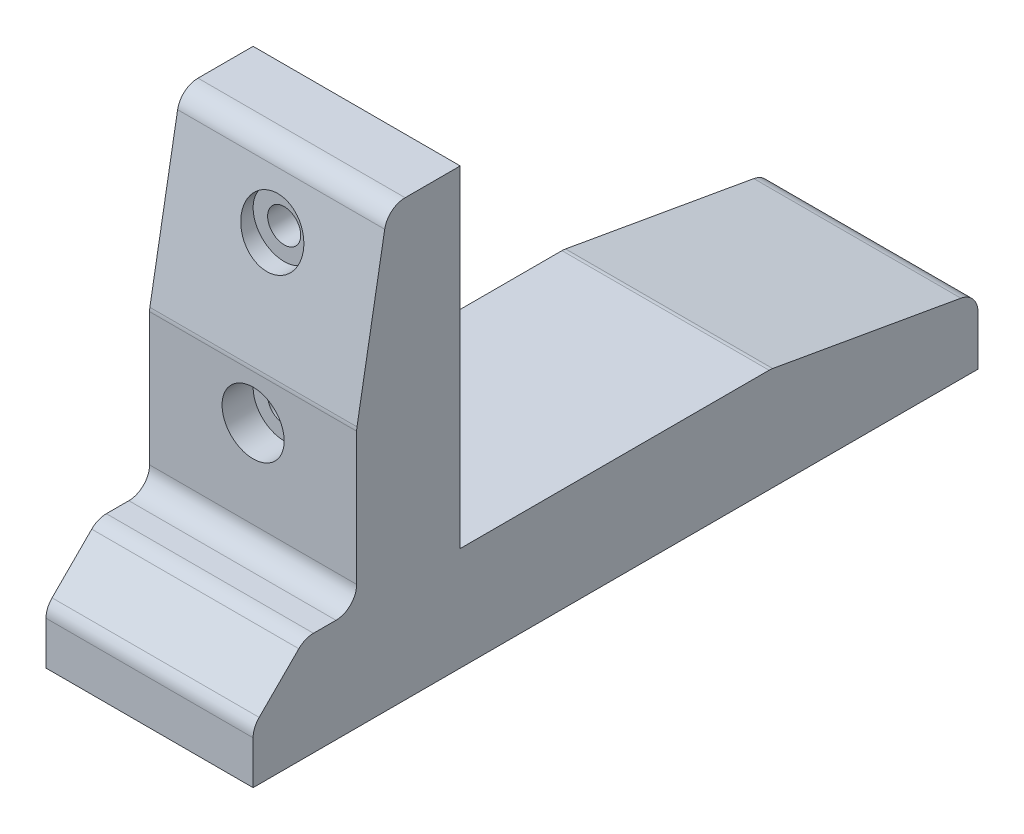
ISO-10303-21;
HEADER;
FILE_DESCRIPTION(('STEP AP214'),'2;1');
FILE_NAME('part.step','',(''),(''),'','','');
FILE_SCHEMA(('AUTOMOTIVE_DESIGN { 1 0 10303 214 1 1 1 1 }'));
ENDSEC;
DATA;
#1=APPLICATION_CONTEXT('core data for automotive mechanical design processes');
#2=APPLICATION_PROTOCOL_DEFINITION('international standard','automotive_design',2000,#1);
#3=PRODUCT_CONTEXT('',#1,'mechanical');
#4=PRODUCT('Part','Part','',(#3));
#5=PRODUCT_RELATED_PRODUCT_CATEGORY('part','',(#4));
#6=PRODUCT_DEFINITION_FORMATION('','',#4);
#7=PRODUCT_DEFINITION_CONTEXT('part definition',#1,'design');
#8=PRODUCT_DEFINITION('design','',#6,#7);
#9=PRODUCT_DEFINITION_SHAPE('','',#8);
#10=(LENGTH_UNIT() NAMED_UNIT(*) SI_UNIT(.MILLI.,.METRE.));
#11=(NAMED_UNIT(*) PLANE_ANGLE_UNIT() SI_UNIT($,.RADIAN.));
#12=(NAMED_UNIT(*) SI_UNIT($,.STERADIAN.) SOLID_ANGLE_UNIT());
#13=UNCERTAINTY_MEASURE_WITH_UNIT(LENGTH_MEASURE(1.E-05),#10,'distance_accuracy_value','');
#14=(GEOMETRIC_REPRESENTATION_CONTEXT(3) GLOBAL_UNCERTAINTY_ASSIGNED_CONTEXT((#13)) GLOBAL_UNIT_ASSIGNED_CONTEXT((#10,
#11,#12)) REPRESENTATION_CONTEXT('',''));
#15=CARTESIAN_POINT('',(0.,0.,0.));
#16=DIRECTION('',(0.,0.,1.));
#17=DIRECTION('',(1.,0.,0.));
#18=AXIS2_PLACEMENT_3D('',#15,#16,#17);
#19=CARTESIAN_POINT('',(47.1226918113003,0.,10.));
#20=DIRECTION('',(0.,0.,-1.));
#21=DIRECTION('',(0.,1.,0.));
#22=AXIS2_PLACEMENT_3D('',#19,#20,#21);
#23=PLANE('',#22);
#24=CARTESIAN_POINT('',(37.1226918113003,-58.9606526095627,10.));
#25=DIRECTION('',(0.,0.,-1.));
#26=DIRECTION('',(0.,1.,0.));
#27=AXIS2_PLACEMENT_3D('',#24,#25,#26);
#28=CIRCLE('',#27,3.);
#29=CARTESIAN_POINT('',(37.1226918113003,-55.9606526095627,10.));
#30=VERTEX_POINT('',#29);
#31=EDGE_CURVE('E644',#30,#30,#28,.T.);
#32=ORIENTED_EDGE('',*,*,#31,.T.);
#33=EDGE_LOOP('',(#32));
#34=FACE_BOUND('',#33,.T.);
#35=DIRECTION('',(0.,-1.,0.));
#36=VECTOR('',#35,1.);
#37=CARTESIAN_POINT('',(47.1226918113003,0.,10.));
#38=LINE('',#37,#36);
#39=CARTESIAN_POINT('',(47.1226918113003,-54.6494753954675,10.));
#40=VERTEX_POINT('',#39);
#41=CARTESIAN_POINT('',(47.1226918113003,-67.4606526095627,10.));
#42=VERTEX_POINT('',#41);
#43=EDGE_CURVE('E305',#40,#42,#38,.T.);
#44=ORIENTED_EDGE('',*,*,#43,.F.);
#45=DIRECTION('',(1.,0.,0.));
#46=VECTOR('',#45,1.);
#47=CARTESIAN_POINT('',(27.1226918113003,-54.6494753954675,10.));
#48=LINE('',#47,#46);
#49=CARTESIAN_POINT('',(27.1226918113003,-54.6494753954675,10.));
#50=VERTEX_POINT('',#49);
#51=EDGE_CURVE('E267',#40,#50,#48,.F.);
#52=ORIENTED_EDGE('',*,*,#51,.T.);
#53=DIRECTION('',(0.,-1.,0.));
#54=VECTOR('',#53,1.);
#55=CARTESIAN_POINT('',(27.1226918113003,0.,10.));
#56=LINE('',#55,#54);
#57=CARTESIAN_POINT('',(27.1226918113003,-67.4606526095627,10.));
#58=VERTEX_POINT('',#57);
#59=EDGE_CURVE('E292',#50,#58,#56,.T.);
#60=ORIENTED_EDGE('',*,*,#59,.T.);
#61=DIRECTION('',(-1.,0.,0.));
#62=VECTOR('',#61,1.);
#63=CARTESIAN_POINT('',(47.1226918113003,-67.4606526095627,10.));
#64=LINE('',#63,#62);
#65=EDGE_CURVE('E265',#58,#42,#64,.F.);
#66=ORIENTED_EDGE('',*,*,#65,.T.);
#67=EDGE_LOOP('',(#44,#52,#60,#66));
#68=FACE_BOUND('',#67,.T.);
#69=ADVANCED_FACE('F55',(#34,#68),#23,.F.);
#70=CARTESIAN_POINT('',(47.1226918113003,-79.4606526095627,0.));
#71=DIRECTION('',(0.,1.,0.));
#72=DIRECTION('',(-1.,0.,0.));
#73=AXIS2_PLACEMENT_3D('',#70,#71,#72);
#74=PLANE('',#73);
#75=DIRECTION('',(0.,0.,-1.));
#76=VECTOR('',#75,1.);
#77=CARTESIAN_POINT('',(27.1226918113003,-79.4606526095627,0.));
#78=LINE('',#77,#76);
#79=CARTESIAN_POINT('',(27.1226918113003,-79.4606526095627,20.));
#80=VERTEX_POINT('',#79);
#81=CARTESIAN_POINT('',(27.1226918113003,-79.4606526095627,-50.));
#82=VERTEX_POINT('',#81);
#83=EDGE_CURVE('E206',#80,#82,#78,.T.);
#84=ORIENTED_EDGE('',*,*,#83,.T.);
#85=DIRECTION('',(-1.,0.,0.));
#86=VECTOR('',#85,1.);
#87=CARTESIAN_POINT('',(47.1226918113003,-79.4606526095627,-50.));
#88=LINE('',#87,#86);
#89=CARTESIAN_POINT('',(47.1226918113003,-79.4606526095627,-50.));
#90=VERTEX_POINT('',#89);
#91=EDGE_CURVE('E187',#90,#82,#88,.T.);
#92=ORIENTED_EDGE('',*,*,#91,.F.);
#93=DIRECTION('',(0.,0.,-1.));
#94=VECTOR('',#93,1.);
#95=CARTESIAN_POINT('',(47.1226918113003,-79.4606526095627,0.));
#96=LINE('',#95,#94);
#97=CARTESIAN_POINT('',(47.1226918113003,-79.4606526095627,20.));
#98=VERTEX_POINT('',#97);
#99=EDGE_CURVE('E193',#98,#90,#96,.T.);
#100=ORIENTED_EDGE('',*,*,#99,.F.);
#101=DIRECTION('',(-1.,0.,0.));
#102=VECTOR('',#101,1.);
#103=CARTESIAN_POINT('',(47.1226918113003,-79.4606526095627,20.));
#104=LINE('',#103,#102);
#105=EDGE_CURVE('E310',#98,#80,#104,.T.);
#106=ORIENTED_EDGE('',*,*,#105,.T.);
#107=EDGE_LOOP('',(#84,#92,#100,#106));
#108=FACE_BOUND('',#107,.T.);
#109=ADVANCED_FACE('F204',(#108),#74,.F.);
#110=CARTESIAN_POINT('',(47.1226918113003,0.,-50.));
#111=DIRECTION('',(0.,0.,1.));
#112=DIRECTION('',(1.,0.,0.));
#113=AXIS2_PLACEMENT_3D('',#110,#111,#112);
#114=PLANE('',#113);
#115=DIRECTION('',(0.,1.,0.));
#116=VECTOR('',#115,1.);
#117=CARTESIAN_POINT('',(27.1226918113003,0.,-50.));
#118=LINE('',#117,#116);
#119=CARTESIAN_POINT('',(27.1226918113003,-74.6653914860866,-50.));
#120=VERTEX_POINT('',#119);
#121=EDGE_CURVE('E326',#82,#120,#118,.T.);
#122=ORIENTED_EDGE('',*,*,#121,.T.);
#123=DIRECTION('',(1.,0.,0.));
#124=VECTOR('',#123,1.);
#125=CARTESIAN_POINT('',(47.1226918113003,-74.6653914860866,-50.));
#126=LINE('',#125,#124);
#127=CARTESIAN_POINT('',(47.1226918113003,-74.6653914860866,-50.));
#128=VERTEX_POINT('',#127);
#129=EDGE_CURVE('E190',#120,#128,#126,.T.);
#130=ORIENTED_EDGE('',*,*,#129,.T.);
#131=DIRECTION('',(0.,1.,0.));
#132=VECTOR('',#131,1.);
#133=CARTESIAN_POINT('',(47.1226918113003,0.,-50.));
#134=LINE('',#133,#132);
#135=EDGE_CURVE('E182',#90,#128,#134,.T.);
#136=ORIENTED_EDGE('',*,*,#135,.F.);
#137=ORIENTED_EDGE('',*,*,#91,.T.);
#138=EDGE_LOOP('',(#122,#130,#136,#137));
#139=FACE_BOUND('',#138,.T.);
#140=ADVANCED_FACE('F185',(#139),#114,.F.);
#141=CARTESIAN_POINT('',(47.1226918113003,-69.4606526095627,0.));
#142=DIRECTION('',(0.,1.,0.));
#143=DIRECTION('',(-1.,0.,0.));
#144=AXIS2_PLACEMENT_3D('',#141,#142,#143);
#145=PLANE('',#144);
#146=DIRECTION('',(0.,0.,-1.));
#147=VECTOR('',#146,1.);
#148=CARTESIAN_POINT('',(47.1226918113003,-69.4606526095627,0.));
#149=LINE('',#148,#147);
#150=CARTESIAN_POINT('',(47.1226918113003,-69.4606526095627,0.));
#151=VERTEX_POINT('',#150);
#152=CARTESIAN_POINT('',(47.1226918113003,-69.4606526095627,-29.8250226729478));
#153=VERTEX_POINT('',#152);
#154=EDGE_CURVE('E192',#151,#153,#149,.T.);
#155=ORIENTED_EDGE('',*,*,#154,.T.);
#156=DIRECTION('',(-1.,0.,0.));
#157=VECTOR('',#156,1.);
#158=CARTESIAN_POINT('',(47.1226918113003,-69.4606526095627,-29.8250226729478));
#159=LINE('',#158,#157);
#160=CARTESIAN_POINT('',(27.1226918113003,-69.4606526095627,-29.8250226729478));
#161=VERTEX_POINT('',#160);
#162=EDGE_CURVE('E282',#153,#161,#159,.T.);
#163=ORIENTED_EDGE('',*,*,#162,.T.);
#164=DIRECTION('',(0.,0.,-1.));
#165=VECTOR('',#164,1.);
#166=CARTESIAN_POINT('',(27.1226918113003,-69.4606526095627,0.));
#167=LINE('',#166,#165);
#168=CARTESIAN_POINT('',(27.1226918113003,-69.4606526095627,0.));
#169=VERTEX_POINT('',#168);
#170=EDGE_CURVE('E329',#169,#161,#167,.T.);
#171=ORIENTED_EDGE('',*,*,#170,.F.);
#172=DIRECTION('',(-1.,0.,0.));
#173=VECTOR('',#172,1.);
#174=CARTESIAN_POINT('',(47.1226918113003,-69.4606526095627,0.));
#175=LINE('',#174,#173);
#176=EDGE_CURVE('E208',#151,#169,#175,.T.);
#177=ORIENTED_EDGE('',*,*,#176,.F.);
#178=EDGE_LOOP('',(#155,#163,#171,#177));
#179=FACE_BOUND('',#178,.T.);
#180=ADVANCED_FACE('F348',(#179),#145,.T.);
#181=CARTESIAN_POINT('',(47.1226918113003,0.,0.));
#182=DIRECTION('',(0.,0.,-1.));
#183=DIRECTION('',(0.,1.,0.));
#184=AXIS2_PLACEMENT_3D('',#181,#182,#183);
#185=PLANE('',#184);
#186=CARTESIAN_POINT('',(37.1226918113003,-43.9606526095627,0.));
#187=DIRECTION('',(0.,0.,-1.));
#188=DIRECTION('',(0.,1.,0.));
#189=AXIS2_PLACEMENT_3D('',#186,#187,#188);
#190=CIRCLE('',#189,1.6);
#191=CARTESIAN_POINT('',(37.1226918113003,-42.3606526095627,0.));
#192=VERTEX_POINT('',#191);
#193=EDGE_CURVE('E327',#192,#192,#190,.T.);
#194=ORIENTED_EDGE('',*,*,#193,.F.);
#195=EDGE_LOOP('',(#194));
#196=FACE_BOUND('',#195,.T.);
#197=CARTESIAN_POINT('',(37.1226918113003,-58.9606526095627,0.));
#198=DIRECTION('',(0.,0.,-1.));
#199=DIRECTION('',(0.,1.,0.));
#200=AXIS2_PLACEMENT_3D('',#197,#198,#199);
#201=CIRCLE('',#200,1.6);
#202=CARTESIAN_POINT('',(37.1226918113003,-57.3606526095627,0.));
#203=VERTEX_POINT('',#202);
#204=EDGE_CURVE('E637',#203,#203,#201,.T.);
#205=ORIENTED_EDGE('',*,*,#204,.F.);
#206=EDGE_LOOP('',(#205));
#207=FACE_BOUND('',#206,.T.);
#208=DIRECTION('',(0.,-1.,0.));
#209=VECTOR('',#208,1.);
#210=CARTESIAN_POINT('',(27.1226918113003,0.,0.));
#211=LINE('',#210,#209);
#212=CARTESIAN_POINT('',(27.1226918113003,-37.4606526095627,0.));
#213=VERTEX_POINT('',#212);
#214=EDGE_CURVE('E332',#213,#169,#211,.T.);
#215=ORIENTED_EDGE('',*,*,#214,.F.);
#216=DIRECTION('',(-1.,0.,0.));
#217=VECTOR('',#216,1.);
#218=CARTESIAN_POINT('',(47.1226918113003,-37.4606526095627,0.));
#219=LINE('',#218,#217);
#220=CARTESIAN_POINT('',(47.1226918113003,-37.4606526095627,0.));
#221=VERTEX_POINT('',#220);
#222=EDGE_CURVE('E213',#221,#213,#219,.T.);
#223=ORIENTED_EDGE('',*,*,#222,.F.);
#224=DIRECTION('',(0.,-1.,0.));
#225=VECTOR('',#224,1.);
#226=CARTESIAN_POINT('',(47.1226918113003,0.,0.));
#227=LINE('',#226,#225);
#228=EDGE_CURVE('E316',#221,#151,#227,.T.);
#229=ORIENTED_EDGE('',*,*,#228,.T.);
#230=ORIENTED_EDGE('',*,*,#176,.T.);
#231=EDGE_LOOP('',(#215,#223,#229,#230));
#232=FACE_BOUND('',#231,.T.);
#233=ADVANCED_FACE('F346',(#196,#207,#232),#185,.T.);
#234=CARTESIAN_POINT('',(47.1226918113003,-37.4606526095627,0.));
#235=DIRECTION('',(0.,-1.,0.));
#236=DIRECTION('',(1.,0.,0.));
#237=AXIS2_PLACEMENT_3D('',#234,#235,#236);
#238=PLANE('',#237);
#239=DIRECTION('',(0.,0.,1.));
#240=VECTOR('',#239,1.);
#241=CARTESIAN_POINT('',(27.1226918113003,-37.4606526095627,0.));
#242=LINE('',#241,#240);
#243=CARTESIAN_POINT('',(27.1226918113003,-37.4606526095627,5.32180073764545));
#244=VERTEX_POINT('',#243);
#245=EDGE_CURVE('E298',#213,#244,#242,.T.);
#246=ORIENTED_EDGE('',*,*,#245,.T.);
#247=DIRECTION('',(-1.,0.,0.));
#248=VECTOR('',#247,1.);
#249=CARTESIAN_POINT('',(47.1226918113003,-37.4606526095627,5.32180073764545));
#250=LINE('',#249,#248);
#251=CARTESIAN_POINT('',(47.1226918113003,-37.4606526095627,5.32180073764545));
#252=VERTEX_POINT('',#251);
#253=EDGE_CURVE('E230',#244,#252,#250,.F.);
#254=ORIENTED_EDGE('',*,*,#253,.T.);
#255=DIRECTION('',(0.,0.,1.));
#256=VECTOR('',#255,1.);
#257=CARTESIAN_POINT('',(47.1226918113003,-37.4606526095627,0.));
#258=LINE('',#257,#256);
#259=EDGE_CURVE('E312',#221,#252,#258,.T.);
#260=ORIENTED_EDGE('',*,*,#259,.F.);
#261=ORIENTED_EDGE('',*,*,#222,.T.);
#262=EDGE_LOOP('',(#246,#254,#260,#261));
#263=FACE_BOUND('',#262,.T.);
#264=ADVANCED_FACE('F342',(#263),#238,.F.);
#265=CARTESIAN_POINT('',(47.1226918113003,-69.4606526095627,14.1715728752538));
#266=VERTEX_POINT('',#265);
#267=CARTESIAN_POINT('',(47.1226918113003,-69.4606526095627,12.));
#268=VERTEX_POINT('',#267);
#269=EDGE_CURVE('E304',#266,#268,#149,.T.);
#270=ORIENTED_EDGE('',*,*,#269,.T.);
#271=DIRECTION('',(-1.,0.,0.));
#272=VECTOR('',#271,1.);
#273=CARTESIAN_POINT('',(47.1226918113003,-69.4606526095627,12.));
#274=LINE('',#273,#272);
#275=CARTESIAN_POINT('',(27.1226918113003,-69.4606526095627,12.));
#276=VERTEX_POINT('',#275);
#277=EDGE_CURVE('E273',#268,#276,#274,.T.);
#278=ORIENTED_EDGE('',*,*,#277,.T.);
#279=CARTESIAN_POINT('',(27.1226918113003,-69.4606526095627,14.1715728752538));
#280=VERTEX_POINT('',#279);
#281=EDGE_CURVE('E293',#280,#276,#167,.T.);
#282=ORIENTED_EDGE('',*,*,#281,.F.);
#283=DIRECTION('',(-1.,0.,0.));
#284=VECTOR('',#283,1.);
#285=CARTESIAN_POINT('',(47.1226918113003,-69.4606526095627,14.1715728752538));
#286=LINE('',#285,#284);
#287=EDGE_CURVE('E270',#280,#266,#286,.F.);
#288=ORIENTED_EDGE('',*,*,#287,.T.);
#289=EDGE_LOOP('',(#270,#278,#282,#288));
#290=FACE_BOUND('',#289,.T.);
#291=ADVANCED_FACE('F307',(#290),#145,.T.);
#292=CARTESIAN_POINT('',(47.1226918113003,0.,20.));
#293=DIRECTION('',(0.,0.,1.));
#294=DIRECTION('',(1.,0.,0.));
#295=AXIS2_PLACEMENT_3D('',#292,#293,#294);
#296=PLANE('',#295);
#297=DIRECTION('',(0.,1.,0.));
#298=VECTOR('',#297,1.);
#299=CARTESIAN_POINT('',(47.1226918113003,0.,20.));
#300=LINE('',#299,#298);
#301=CARTESIAN_POINT('',(47.1226918113003,-75.2890797343089,20.));
#302=VERTEX_POINT('',#301);
#303=EDGE_CURVE('E200',#98,#302,#300,.T.);
#304=ORIENTED_EDGE('',*,*,#303,.T.);
#305=DIRECTION('',(1.,0.,0.));
#306=VECTOR('',#305,1.);
#307=CARTESIAN_POINT('',(47.1226918113003,-75.2890797343089,20.));
#308=LINE('',#307,#306);
#309=CARTESIAN_POINT('',(27.1226918113003,-75.2890797343089,20.));
#310=VERTEX_POINT('',#309);
#311=EDGE_CURVE('E279',#302,#310,#308,.F.);
#312=ORIENTED_EDGE('',*,*,#311,.T.);
#313=DIRECTION('',(0.,1.,0.));
#314=VECTOR('',#313,1.);
#315=CARTESIAN_POINT('',(27.1226918113003,0.,20.));
#316=LINE('',#315,#314);
#317=EDGE_CURVE('E202',#80,#310,#316,.T.);
#318=ORIENTED_EDGE('',*,*,#317,.F.);
#319=ORIENTED_EDGE('',*,*,#105,.F.);
#320=EDGE_LOOP('',(#304,#312,#318,#319));
#321=FACE_BOUND('',#320,.T.);
#322=ADVANCED_FACE('F362',(#321),#296,.T.);
#323=CARTESIAN_POINT('',(47.1226918113003,0.,0.));
#324=DIRECTION('',(1.,0.,0.));
#325=DIRECTION('',(0.,1.,0.));
#326=AXIS2_PLACEMENT_3D('',#323,#324,#325);
#327=PLANE('',#326);
#328=ORIENTED_EDGE('',*,*,#259,.T.);
#329=CARTESIAN_POINT('',(47.1226918113003,-39.4606526095627,5.32180073764545));
#330=DIRECTION('',(1.,0.,0.));
#331=DIRECTION('',(0.,1.,0.));
#332=AXIS2_PLACEMENT_3D('',#329,#330,#331);
#333=CIRCLE('',#332,2.);
#334=CARTESIAN_POINT('',(47.1226918113003,-39.1133562542288,7.29141624366986));
#335=VERTEX_POINT('',#334);
#336=EDGE_CURVE('E248',#252,#335,#333,.T.);
#337=ORIENTED_EDGE('',*,*,#336,.T.);
#338=DIRECTION('',(0.,0.984807753012208,-0.173648177666932));
#339=VECTOR('',#338,1.);
#340=CARTESIAN_POINT('',(47.1226918113003,0.0674936103737087,0.382775285452745));
#341=LINE('',#340,#339);
#342=CARTESIAN_POINT('',(47.1226918113003,-54.3021790401336,9.96961550602442));
#343=VERTEX_POINT('',#342);
#344=EDGE_CURVE('E227',#335,#343,#341,.F.);
#345=ORIENTED_EDGE('',*,*,#344,.T.);
#346=CARTESIAN_POINT('',(47.1226918113003,-54.6494753954675,8.));
#347=DIRECTION('',(1.,0.,0.));
#348=DIRECTION('',(0.,1.,0.));
#349=AXIS2_PLACEMENT_3D('',#346,#347,#348);
#350=CIRCLE('',#349,2.);
#351=EDGE_CURVE('E246',#343,#40,#350,.T.);
#352=ORIENTED_EDGE('',*,*,#351,.T.);
#353=ORIENTED_EDGE('',*,*,#43,.T.);
#354=CARTESIAN_POINT('',(47.1226918113003,-67.4606526095627,12.));
#355=DIRECTION('',(1.,0.,0.));
#356=DIRECTION('',(0.,1.,0.));
#357=AXIS2_PLACEMENT_3D('',#354,#355,#356);
#358=CIRCLE('',#357,2.);
#359=EDGE_CURVE('E12',#42,#268,#358,.F.);
#360=ORIENTED_EDGE('',*,*,#359,.T.);
#361=ORIENTED_EDGE('',*,*,#269,.F.);
#362=CARTESIAN_POINT('',(47.1226918113003,-71.4606526095627,14.1715728752538));
#363=DIRECTION('',(1.,0.,0.));
#364=DIRECTION('',(0.,1.,0.));
#365=AXIS2_PLACEMENT_3D('',#362,#363,#364);
#366=CIRCLE('',#365,2.);
#367=CARTESIAN_POINT('',(47.1226918113003,-70.0464390471896,15.5857864376269));
#368=VERTEX_POINT('',#367);
#369=EDGE_CURVE('E244',#266,#368,#366,.T.);
#370=ORIENTED_EDGE('',*,*,#369,.T.);
#371=DIRECTION('',(0.,0.707106781186547,-0.707106781186548));
#372=VECTOR('',#371,1.);
#373=CARTESIAN_POINT('',(47.1226918113003,-27.2303263047814,-27.2303263047814));
#374=LINE('',#373,#372);
#375=CARTESIAN_POINT('',(47.1226918113003,-73.8748661719358,19.4142135623731));
#376=VERTEX_POINT('',#375);
#377=EDGE_CURVE('E221',#368,#376,#374,.F.);
#378=ORIENTED_EDGE('',*,*,#377,.T.);
#379=CARTESIAN_POINT('',(47.1226918113003,-75.2890797343089,18.));
#380=DIRECTION('',(1.,0.,0.));
#381=DIRECTION('',(0.,1.,0.));
#382=AXIS2_PLACEMENT_3D('',#379,#380,#381);
#383=CIRCLE('',#382,2.);
#384=EDGE_CURVE('E242',#376,#302,#383,.T.);
#385=ORIENTED_EDGE('',*,*,#384,.T.);
#386=ORIENTED_EDGE('',*,*,#303,.F.);
#387=ORIENTED_EDGE('',*,*,#99,.T.);
#388=ORIENTED_EDGE('',*,*,#135,.T.);
#389=CARTESIAN_POINT('',(47.1226918113003,-74.6653914860866,-48.));
#390=DIRECTION('',(1.,0.,0.));
#391=DIRECTION('',(0.,1.,0.));
#392=AXIS2_PLACEMENT_3D('',#389,#390,#391);
#393=CIRCLE('',#392,2.);
#394=CARTESIAN_POINT('',(47.1226918113003,-72.6957759800622,-48.3472963553339));
#395=VERTEX_POINT('',#394);
#396=EDGE_CURVE('E238',#128,#395,#393,.T.);
#397=ORIENTED_EDGE('',*,*,#396,.T.);
#398=DIRECTION('',(0.,0.173648177666928,0.984807753012208));
#399=VECTOR('',#398,1.);
#400=CARTESIAN_POINT('',(47.1226918113003,-62.2358555009862,10.9738604922971));
#401=LINE('',#400,#399);
#402=CARTESIAN_POINT('',(47.1226918113003,-69.4910371035383,-30.1723190282817));
#403=VERTEX_POINT('',#402);
#404=EDGE_CURVE('E211',#395,#403,#401,.T.);
#405=ORIENTED_EDGE('',*,*,#404,.T.);
#406=CARTESIAN_POINT('',(47.1226918113003,-71.4606526095627,-29.8250226729478));
#407=DIRECTION('',(1.,0.,0.));
#408=DIRECTION('',(0.,1.,0.));
#409=AXIS2_PLACEMENT_3D('',#406,#407,#408);
#410=CIRCLE('',#409,2.);
#411=EDGE_CURVE('E240',#403,#153,#410,.T.);
#412=ORIENTED_EDGE('',*,*,#411,.T.);
#413=ORIENTED_EDGE('',*,*,#154,.F.);
#414=ORIENTED_EDGE('',*,*,#228,.F.);
#415=EDGE_LOOP('',(#328,#337,#345,#352,#353,#360,#361,#370,#378,#385,#386,#387,#388,#397,#405,
#412,#413,#414));
#416=FACE_BOUND('',#415,.T.);
#417=ADVANCED_FACE('F198',(#416),#327,.T.);
#418=CARTESIAN_POINT('',(27.1226918113003,0.,0.));
#419=DIRECTION('',(1.,0.,0.));
#420=DIRECTION('',(0.,1.,0.));
#421=AXIS2_PLACEMENT_3D('',#418,#419,#420);
#422=PLANE('',#421);
#423=DIRECTION('',(0.,-0.984807753012208,0.173648177666932));
#424=VECTOR('',#423,1.);
#425=CARTESIAN_POINT('',(27.1226918113003,-54.4744980684156,10.));
#426=LINE('',#425,#424);
#427=CARTESIAN_POINT('',(27.1226918113003,-54.3021790401336,9.96961550602441));
#428=VERTEX_POINT('',#427);
#429=CARTESIAN_POINT('',(27.1226918113003,-39.1133562542288,7.29141624366986));
#430=VERTEX_POINT('',#429);
#431=EDGE_CURVE('E224',#428,#430,#426,.F.);
#432=ORIENTED_EDGE('',*,*,#431,.T.);
#433=CARTESIAN_POINT('',(27.1226918113003,-39.4606526095627,5.32180073764545));
#434=DIRECTION('',(1.,0.,0.));
#435=DIRECTION('',(0.,1.,0.));
#436=AXIS2_PLACEMENT_3D('',#433,#434,#435);
#437=CIRCLE('',#436,2.);
#438=EDGE_CURVE('E263',#430,#244,#437,.F.);
#439=ORIENTED_EDGE('',*,*,#438,.T.);
#440=ORIENTED_EDGE('',*,*,#245,.F.);
#441=ORIENTED_EDGE('',*,*,#214,.T.);
#442=ORIENTED_EDGE('',*,*,#170,.T.);
#443=CARTESIAN_POINT('',(27.1226918113003,-71.4606526095627,-29.8250226729478));
#444=DIRECTION('',(1.,0.,0.));
#445=DIRECTION('',(0.,1.,0.));
#446=AXIS2_PLACEMENT_3D('',#443,#444,#445);
#447=CIRCLE('',#446,2.);
#448=CARTESIAN_POINT('',(27.1226918113003,-69.4910371035383,-30.1723190282817));
#449=VERTEX_POINT('',#448);
#450=EDGE_CURVE('E256',#161,#449,#447,.F.);
#451=ORIENTED_EDGE('',*,*,#450,.T.);
#452=DIRECTION('',(0.,-0.173648177666928,-0.984807753012208));
#453=VECTOR('',#452,1.);
#454=CARTESIAN_POINT('',(27.1226918113003,-69.4606526095627,-29.9999999999996));
#455=LINE('',#454,#453);
#456=CARTESIAN_POINT('',(27.1226918113003,-72.6957759800622,-48.3472963553339));
#457=VERTEX_POINT('',#456);
#458=EDGE_CURVE('E207',#449,#457,#455,.T.);
#459=ORIENTED_EDGE('',*,*,#458,.T.);
#460=CARTESIAN_POINT('',(27.1226918113003,-74.6653914860866,-48.));
#461=DIRECTION('',(1.,0.,0.));
#462=DIRECTION('',(0.,1.,0.));
#463=AXIS2_PLACEMENT_3D('',#460,#461,#462);
#464=CIRCLE('',#463,2.);
#465=EDGE_CURVE('E254',#457,#120,#464,.F.);
#466=ORIENTED_EDGE('',*,*,#465,.T.);
#467=ORIENTED_EDGE('',*,*,#121,.F.);
#468=ORIENTED_EDGE('',*,*,#83,.F.);
#469=ORIENTED_EDGE('',*,*,#317,.T.);
#470=CARTESIAN_POINT('',(27.1226918113003,-75.2890797343089,18.));
#471=DIRECTION('',(1.,0.,0.));
#472=DIRECTION('',(0.,1.,0.));
#473=AXIS2_PLACEMENT_3D('',#470,#471,#472);
#474=CIRCLE('',#473,2.);
#475=CARTESIAN_POINT('',(27.1226918113003,-73.8748661719358,19.4142135623731));
#476=VERTEX_POINT('',#475);
#477=EDGE_CURVE('E258',#310,#476,#474,.F.);
#478=ORIENTED_EDGE('',*,*,#477,.T.);
#479=DIRECTION('',(0.,-0.707106781186547,0.707106781186548));
#480=VECTOR('',#479,1.);
#481=CARTESIAN_POINT('',(27.1226918113003,-74.4606526095627,20.));
#482=LINE('',#481,#480);
#483=CARTESIAN_POINT('',(27.1226918113003,-70.0464390471896,15.5857864376269));
#484=VERTEX_POINT('',#483);
#485=EDGE_CURVE('E219',#476,#484,#482,.F.);
#486=ORIENTED_EDGE('',*,*,#485,.T.);
#487=CARTESIAN_POINT('',(27.1226918113003,-71.4606526095627,14.1715728752538));
#488=DIRECTION('',(1.,0.,0.));
#489=DIRECTION('',(0.,1.,0.));
#490=AXIS2_PLACEMENT_3D('',#487,#488,#489);
#491=CIRCLE('',#490,2.);
#492=EDGE_CURVE('E77',#484,#280,#491,.F.);
#493=ORIENTED_EDGE('',*,*,#492,.T.);
#494=ORIENTED_EDGE('',*,*,#281,.T.);
#495=CARTESIAN_POINT('',(27.1226918113003,-67.4606526095627,12.));
#496=DIRECTION('',(1.,0.,0.));
#497=DIRECTION('',(0.,1.,0.));
#498=AXIS2_PLACEMENT_3D('',#495,#496,#497);
#499=CIRCLE('',#498,2.);
#500=EDGE_CURVE('E63',#276,#58,#499,.T.);
#501=ORIENTED_EDGE('',*,*,#500,.T.);
#502=ORIENTED_EDGE('',*,*,#59,.F.);
#503=CARTESIAN_POINT('',(27.1226918113003,-54.6494753954675,8.));
#504=DIRECTION('',(1.,0.,0.));
#505=DIRECTION('',(0.,1.,0.));
#506=AXIS2_PLACEMENT_3D('',#503,#504,#505);
#507=CIRCLE('',#506,2.);
#508=EDGE_CURVE('E261',#50,#428,#507,.F.);
#509=ORIENTED_EDGE('',*,*,#508,.T.);
#510=EDGE_LOOP('',(#432,#439,#440,#441,#442,#451,#459,#466,#467,#468,#469,#478,#486,#493,#494,
#501,#502,#509));
#511=FACE_BOUND('',#510,.T.);
#512=ADVANCED_FACE('F291',(#511),#422,.F.);
#513=CARTESIAN_POINT('',(37.1226918113003,-58.9606526095627,20.));
#514=DIRECTION('',(0.,0.,-1.));
#515=DIRECTION('',(0.,1.,0.));
#516=AXIS2_PLACEMENT_3D('',#513,#514,#515);
#517=CYLINDRICAL_SURFACE('',#516,1.6);
#518=CARTESIAN_POINT('',(37.1226918113003,-58.9606526095627,7.));
#519=DIRECTION('',(0.,0.,-1.));
#520=DIRECTION('',(0.,1.,0.));
#521=AXIS2_PLACEMENT_3D('',#518,#519,#520);
#522=CIRCLE('',#521,1.6);
#523=CARTESIAN_POINT('',(37.1226918113003,-57.3606526095627,7.));
#524=VERTEX_POINT('',#523);
#525=EDGE_CURVE('E634',#524,#524,#522,.T.);
#526=ORIENTED_EDGE('',*,*,#525,.F.);
#527=EDGE_LOOP('',(#526));
#528=FACE_BOUND('',#527,.T.);
#529=ORIENTED_EDGE('',*,*,#204,.T.);
#530=EDGE_LOOP('',(#529));
#531=FACE_BOUND('',#530,.T.);
#532=ADVANCED_FACE('F458',(#528,#531),#517,.F.);
#533=CARTESIAN_POINT('',(37.1226918113003,-43.9606526095627,20.));
#534=DIRECTION('',(0.,0.,-1.));
#535=DIRECTION('',(0.,1.,0.));
#536=AXIS2_PLACEMENT_3D('',#533,#534,#535);
#537=CYLINDRICAL_SURFACE('',#536,1.6);
#538=CARTESIAN_POINT('',(37.1226918113003,-43.9606526095627,7.));
#539=DIRECTION('',(0.,0.,-1.));
#540=DIRECTION('',(0.,1.,0.));
#541=AXIS2_PLACEMENT_3D('',#538,#539,#540);
#542=CIRCLE('',#541,1.6);
#543=CARTESIAN_POINT('',(37.1226918113003,-42.3606526095627,7.));
#544=VERTEX_POINT('',#543);
#545=EDGE_CURVE('E235',#544,#544,#542,.T.);
#546=ORIENTED_EDGE('',*,*,#545,.F.);
#547=EDGE_LOOP('',(#546));
#548=FACE_BOUND('',#547,.T.);
#549=ORIENTED_EDGE('',*,*,#193,.T.);
#550=EDGE_LOOP('',(#549));
#551=FACE_BOUND('',#550,.T.);
#552=ADVANCED_FACE('F449',(#548,#551),#537,.F.);
#553=CARTESIAN_POINT('',(37.1226918113003,-43.9606526095627,7.));
#554=DIRECTION('',(0.,0.,-1.));
#555=DIRECTION('',(0.,1.,0.));
#556=AXIS2_PLACEMENT_3D('',#553,#554,#555);
#557=PLANE('',#556);
#558=CARTESIAN_POINT('',(37.1226918113003,-43.9606526095627,7.));
#559=DIRECTION('',(0.,0.,-1.));
#560=DIRECTION('',(0.,1.,0.));
#561=AXIS2_PLACEMENT_3D('',#558,#559,#560);
#562=CIRCLE('',#561,3.);
#563=CARTESIAN_POINT('',(37.1226918113003,-40.9606526095627,7.));
#564=VERTEX_POINT('',#563);
#565=EDGE_CURVE('E234',#564,#564,#562,.T.);
#566=ORIENTED_EDGE('',*,*,#565,.F.);
#567=EDGE_LOOP('',(#566));
#568=FACE_BOUND('',#567,.T.);
#569=ORIENTED_EDGE('',*,*,#545,.T.);
#570=EDGE_LOOP('',(#569));
#571=FACE_BOUND('',#570,.T.);
#572=ADVANCED_FACE('F439',(#568,#571),#557,.F.);
#573=CARTESIAN_POINT('',(37.1226918113003,-43.9606526095627,7.));
#574=DIRECTION('',(0.,0.,1.));
#575=DIRECTION('',(0.,-1.,0.));
#576=AXIS2_PLACEMENT_3D('',#573,#574,#575);
#577=CYLINDRICAL_SURFACE('',#576,3.);
#578=ORIENTED_EDGE('',*,*,#565,.T.);
#579=EDGE_LOOP('',(#578));
#580=FACE_BOUND('',#579,.T.);
#581=CARTESIAN_POINT('',(37.1226918113003,-43.9606526095627,8.14612537460503));
#582=DIRECTION('',(0.,-0.173648177666932,-0.984807753012208));
#583=DIRECTION('',(0.,-0.984807753012208,0.173648177666932));
#584=AXIS2_PLACEMENT_3D('',#581,#582,#583);
#585=ELLIPSE('',#584,3.04627983565724,3.);
#586=CARTESIAN_POINT('',(37.1226918113003,-46.9606526095627,8.67510631673044));
#587=VERTEX_POINT('',#586);
#588=EDGE_CURVE('E231',#587,#587,#585,.T.);
#589=ORIENTED_EDGE('',*,*,#588,.F.);
#590=EDGE_LOOP('',(#589));
#591=FACE_BOUND('',#590,.T.);
#592=ADVANCED_FACE('F437',(#580,#591),#577,.F.);
#593=CARTESIAN_POINT('',(37.1226918113003,-58.9606526095627,7.));
#594=DIRECTION('',(0.,0.,-1.));
#595=DIRECTION('',(0.,1.,0.));
#596=AXIS2_PLACEMENT_3D('',#593,#594,#595);
#597=PLANE('',#596);
#598=CARTESIAN_POINT('',(37.1226918113003,-58.9606526095627,7.));
#599=DIRECTION('',(0.,0.,-1.));
#600=DIRECTION('',(0.,1.,0.));
#601=AXIS2_PLACEMENT_3D('',#598,#599,#600);
#602=CIRCLE('',#601,3.);
#603=CARTESIAN_POINT('',(37.1226918113003,-55.9606526095627,7.));
#604=VERTEX_POINT('',#603);
#605=EDGE_CURVE('E646',#604,#604,#602,.T.);
#606=ORIENTED_EDGE('',*,*,#605,.F.);
#607=EDGE_LOOP('',(#606));
#608=FACE_BOUND('',#607,.T.);
#609=ORIENTED_EDGE('',*,*,#525,.T.);
#610=EDGE_LOOP('',(#609));
#611=FACE_BOUND('',#610,.T.);
#612=ADVANCED_FACE('F438',(#608,#611),#597,.F.);
#613=CARTESIAN_POINT('',(37.1226918113003,-58.9606526095627,7.));
#614=DIRECTION('',(0.,0.,1.));
#615=DIRECTION('',(0.,-1.,0.));
#616=AXIS2_PLACEMENT_3D('',#613,#614,#615);
#617=CYLINDRICAL_SURFACE('',#616,3.);
#618=ORIENTED_EDGE('',*,*,#605,.T.);
#619=EDGE_LOOP('',(#618));
#620=FACE_BOUND('',#619,.T.);
#621=ORIENTED_EDGE('',*,*,#31,.F.);
#622=EDGE_LOOP('',(#621));
#623=FACE_BOUND('',#622,.T.);
#624=ADVANCED_FACE('F409',(#620,#623),#617,.F.);
#625=CARTESIAN_POINT('',(47.1226918113003,-69.4606526095627,-29.9999999999996));
#626=DIRECTION('',(0.,0.984807753012208,-0.173648177666928));
#627=DIRECTION('',(1.,0.,0.));
#628=AXIS2_PLACEMENT_3D('',#625,#626,#627);
#629=PLANE('',#628);
#630=ORIENTED_EDGE('',*,*,#458,.F.);
#631=DIRECTION('',(-1.,0.,0.));
#632=VECTOR('',#631,1.);
#633=CARTESIAN_POINT('',(47.1226918113003,-69.4910371035383,-30.1723190282817));
#634=LINE('',#633,#632);
#635=EDGE_CURVE('E287',#449,#403,#634,.F.);
#636=ORIENTED_EDGE('',*,*,#635,.T.);
#637=ORIENTED_EDGE('',*,*,#404,.F.);
#638=DIRECTION('',(1.,0.,0.));
#639=VECTOR('',#638,1.);
#640=CARTESIAN_POINT('',(27.1226918113003,-72.6957759800622,-48.3472963553339));
#641=LINE('',#640,#639);
#642=EDGE_CURVE('E285',#395,#457,#641,.F.);
#643=ORIENTED_EDGE('',*,*,#642,.T.);
#644=EDGE_LOOP('',(#630,#636,#637,#643));
#645=FACE_BOUND('',#644,.T.);
#646=ADVANCED_FACE('F354',(#645),#629,.T.);
#647=CARTESIAN_POINT('',(47.1226918113003,-74.4606526095627,20.));
#648=DIRECTION('',(0.,-0.707106781186548,-0.707106781186547));
#649=DIRECTION('',(-1.,0.,0.));
#650=AXIS2_PLACEMENT_3D('',#647,#648,#649);
#651=PLANE('',#650);
#652=ORIENTED_EDGE('',*,*,#377,.F.);
#653=DIRECTION('',(1.,0.,0.));
#654=VECTOR('',#653,1.);
#655=CARTESIAN_POINT('',(47.1226918113003,-70.0464390471896,15.5857864376269));
#656=LINE('',#655,#654);
#657=EDGE_CURVE('E277',#368,#484,#656,.F.);
#658=ORIENTED_EDGE('',*,*,#657,.T.);
#659=ORIENTED_EDGE('',*,*,#485,.F.);
#660=DIRECTION('',(-1.,0.,0.));
#661=VECTOR('',#660,1.);
#662=CARTESIAN_POINT('',(47.1226918113003,-73.8748661719358,19.4142135623731));
#663=LINE('',#662,#661);
#664=EDGE_CURVE('E275',#476,#376,#663,.F.);
#665=ORIENTED_EDGE('',*,*,#664,.T.);
#666=EDGE_LOOP('',(#652,#658,#659,#665));
#667=FACE_BOUND('',#666,.T.);
#668=ADVANCED_FACE('F371',(#667),#651,.F.);
#669=CARTESIAN_POINT('',(47.1226918113003,-54.4744980684156,10.));
#670=DIRECTION('',(0.,-0.173648177666932,-0.984807753012208));
#671=DIRECTION('',(-1.,0.,0.));
#672=AXIS2_PLACEMENT_3D('',#669,#670,#671);
#673=PLANE('',#672);
#674=ORIENTED_EDGE('',*,*,#344,.F.);
#675=DIRECTION('',(1.,0.,0.));
#676=VECTOR('',#675,1.);
#677=CARTESIAN_POINT('',(27.1226918113003,-39.1133562542288,7.29141624366986));
#678=LINE('',#677,#676);
#679=EDGE_CURVE('E252',#335,#430,#678,.F.);
#680=ORIENTED_EDGE('',*,*,#679,.T.);
#681=ORIENTED_EDGE('',*,*,#431,.F.);
#682=DIRECTION('',(-1.,0.,0.));
#683=VECTOR('',#682,1.);
#684=CARTESIAN_POINT('',(47.1226918113003,-54.3021790401336,9.96961550602441));
#685=LINE('',#684,#683);
#686=EDGE_CURVE('E250',#428,#343,#685,.F.);
#687=ORIENTED_EDGE('',*,*,#686,.T.);
#688=EDGE_LOOP('',(#674,#680,#681,#687));
#689=FACE_BOUND('',#688,.T.);
#690=ORIENTED_EDGE('',*,*,#588,.T.);
#691=EDGE_LOOP('',(#690));
#692=FACE_BOUND('',#691,.T.);
#693=ADVANCED_FACE('F415',(#689,#692),#673,.F.);
#694=CARTESIAN_POINT('',(47.1226918113003,-39.4606526095627,5.32180073764545));
#695=DIRECTION('',(1.,0.,0.));
#696=DIRECTION('',(0.,1.,0.));
#697=AXIS2_PLACEMENT_3D('',#694,#695,#696);
#698=CYLINDRICAL_SURFACE('',#697,2.);
#699=ORIENTED_EDGE('',*,*,#438,.F.);
#700=ORIENTED_EDGE('',*,*,#679,.F.);
#701=ORIENTED_EDGE('',*,*,#336,.F.);
#702=ORIENTED_EDGE('',*,*,#253,.F.);
#703=EDGE_LOOP('',(#699,#700,#701,#702));
#704=FACE_BOUND('',#703,.T.);
#705=ADVANCED_FACE('F420',(#704),#698,.T.);
#706=CARTESIAN_POINT('',(47.1226918113003,-54.6494753954675,8.));
#707=DIRECTION('',(-1.,0.,0.));
#708=DIRECTION('',(0.,-1.,0.));
#709=AXIS2_PLACEMENT_3D('',#706,#707,#708);
#710=CYLINDRICAL_SURFACE('',#709,2.);
#711=ORIENTED_EDGE('',*,*,#351,.F.);
#712=ORIENTED_EDGE('',*,*,#686,.F.);
#713=ORIENTED_EDGE('',*,*,#508,.F.);
#714=ORIENTED_EDGE('',*,*,#51,.F.);
#715=EDGE_LOOP('',(#711,#712,#713,#714));
#716=FACE_BOUND('',#715,.T.);
#717=ADVANCED_FACE('F382',(#716),#710,.T.);
#718=CARTESIAN_POINT('',(47.1226918113003,-67.4606526095627,12.));
#719=DIRECTION('',(-1.,0.,0.));
#720=DIRECTION('',(0.,-1.,0.));
#721=AXIS2_PLACEMENT_3D('',#718,#719,#720);
#722=CYLINDRICAL_SURFACE('',#721,2.);
#723=ORIENTED_EDGE('',*,*,#359,.F.);
#724=ORIENTED_EDGE('',*,*,#65,.F.);
#725=ORIENTED_EDGE('',*,*,#500,.F.);
#726=ORIENTED_EDGE('',*,*,#277,.F.);
#727=EDGE_LOOP('',(#723,#724,#725,#726));
#728=FACE_BOUND('',#727,.T.);
#729=ADVANCED_FACE('F301',(#728),#722,.F.);
#730=CARTESIAN_POINT('',(47.1226918113003,-71.4606526095627,14.1715728752538));
#731=DIRECTION('',(-1.,0.,0.));
#732=DIRECTION('',(0.,-1.,0.));
#733=AXIS2_PLACEMENT_3D('',#730,#731,#732);
#734=CYLINDRICAL_SURFACE('',#733,2.);
#735=ORIENTED_EDGE('',*,*,#492,.F.);
#736=ORIENTED_EDGE('',*,*,#657,.F.);
#737=ORIENTED_EDGE('',*,*,#369,.F.);
#738=ORIENTED_EDGE('',*,*,#287,.F.);
#739=EDGE_LOOP('',(#735,#736,#737,#738));
#740=FACE_BOUND('',#739,.T.);
#741=ADVANCED_FACE('F374',(#740),#734,.T.);
#742=CARTESIAN_POINT('',(47.1226918113003,-75.2890797343089,18.));
#743=DIRECTION('',(1.,0.,0.));
#744=DIRECTION('',(0.,1.,0.));
#745=AXIS2_PLACEMENT_3D('',#742,#743,#744);
#746=CYLINDRICAL_SURFACE('',#745,2.);
#747=ORIENTED_EDGE('',*,*,#384,.F.);
#748=ORIENTED_EDGE('',*,*,#664,.F.);
#749=ORIENTED_EDGE('',*,*,#477,.F.);
#750=ORIENTED_EDGE('',*,*,#311,.F.);
#751=EDGE_LOOP('',(#747,#748,#749,#750));
#752=FACE_BOUND('',#751,.T.);
#753=ADVANCED_FACE('F366',(#752),#746,.T.);
#754=CARTESIAN_POINT('',(47.1226918113003,-71.4606526095627,-29.8250226729478));
#755=DIRECTION('',(-1.,0.,0.));
#756=DIRECTION('',(0.,-1.,0.));
#757=AXIS2_PLACEMENT_3D('',#754,#755,#756);
#758=CYLINDRICAL_SURFACE('',#757,2.);
#759=ORIENTED_EDGE('',*,*,#411,.F.);
#760=ORIENTED_EDGE('',*,*,#635,.F.);
#761=ORIENTED_EDGE('',*,*,#450,.F.);
#762=ORIENTED_EDGE('',*,*,#162,.F.);
#763=EDGE_LOOP('',(#759,#760,#761,#762));
#764=FACE_BOUND('',#763,.T.);
#765=ADVANCED_FACE('F358',(#764),#758,.T.);
#766=CARTESIAN_POINT('',(47.1226918113003,-74.6653914860866,-48.));
#767=DIRECTION('',(-1.,0.,0.));
#768=DIRECTION('',(0.,-1.,0.));
#769=AXIS2_PLACEMENT_3D('',#766,#767,#768);
#770=CYLINDRICAL_SURFACE('',#769,2.);
#771=ORIENTED_EDGE('',*,*,#465,.F.);
#772=ORIENTED_EDGE('',*,*,#642,.F.);
#773=ORIENTED_EDGE('',*,*,#396,.F.);
#774=ORIENTED_EDGE('',*,*,#129,.F.);
#775=EDGE_LOOP('',(#771,#772,#773,#774));
#776=FACE_BOUND('',#775,.T.);
#777=ADVANCED_FACE('F57',(#776),#770,.T.);
#778=CLOSED_SHELL('',(#69,#109,#140,#180,#233,#264,#291,#322,#417,#512,#532,#552,#572,#592,#612,
#624,#646,#668,#693,#705,#717,#729,#741,#753,#765,#777));
#779=MANIFOLD_SOLID_BREP('B2',#778);
#780=ADVANCED_BREP_SHAPE_REPRESENTATION('',(#18,#779),#14);
#781=SHAPE_DEFINITION_REPRESENTATION(#9,#780);
ENDSEC;
END-ISO-10303-21;
